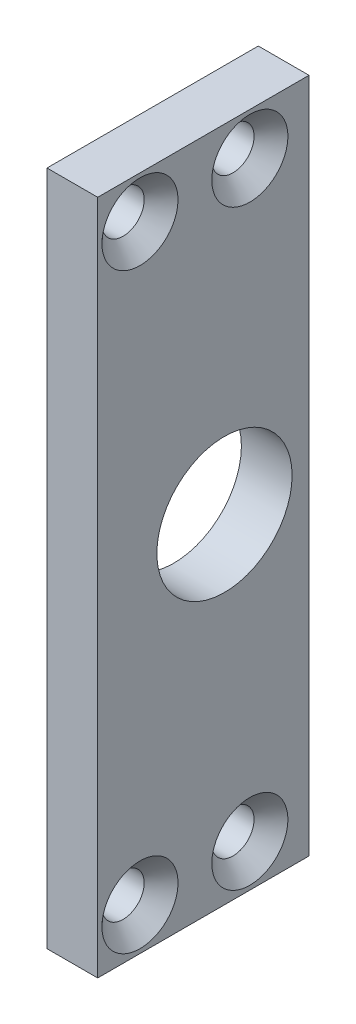
ISO-10303-21;
HEADER;
FILE_DESCRIPTION(('STEP AP214'),'2;1');
FILE_NAME('part.step','',(''),(''),'','','');
FILE_SCHEMA(('AUTOMOTIVE_DESIGN { 1 0 10303 214 1 1 1 1 }'));
ENDSEC;
DATA;
#1=APPLICATION_CONTEXT('core data for automotive mechanical design processes');
#2=APPLICATION_PROTOCOL_DEFINITION('international standard','automotive_design',2000,#1);
#3=PRODUCT_CONTEXT('',#1,'mechanical');
#4=PRODUCT('Part','Part','',(#3));
#5=PRODUCT_RELATED_PRODUCT_CATEGORY('part','',(#4));
#6=PRODUCT_DEFINITION_FORMATION('','',#4);
#7=PRODUCT_DEFINITION_CONTEXT('part definition',#1,'design');
#8=PRODUCT_DEFINITION('design','',#6,#7);
#9=PRODUCT_DEFINITION_SHAPE('','',#8);
#10=(LENGTH_UNIT() NAMED_UNIT(*) SI_UNIT(.MILLI.,.METRE.));
#11=(NAMED_UNIT(*) PLANE_ANGLE_UNIT() SI_UNIT($,.RADIAN.));
#12=(NAMED_UNIT(*) SI_UNIT($,.STERADIAN.) SOLID_ANGLE_UNIT());
#13=UNCERTAINTY_MEASURE_WITH_UNIT(LENGTH_MEASURE(1.E-05),#10,'distance_accuracy_value','');
#14=(GEOMETRIC_REPRESENTATION_CONTEXT(3) GLOBAL_UNCERTAINTY_ASSIGNED_CONTEXT((#13)) GLOBAL_UNIT_ASSIGNED_CONTEXT((#10,
#11,#12)) REPRESENTATION_CONTEXT('',''));
#15=CARTESIAN_POINT('',(0.,0.,0.));
#16=DIRECTION('',(0.,0.,1.));
#17=DIRECTION('',(1.,0.,0.));
#18=AXIS2_PLACEMENT_3D('',#15,#16,#17);
#19=CARTESIAN_POINT('',(6.,0.,0.));
#20=DIRECTION('',(0.,0.,-1.));
#21=DIRECTION('',(-1.,0.,0.));
#22=AXIS2_PLACEMENT_3D('',#19,#20,#21);
#23=PLANE('',#22);
#24=DIRECTION('',(0.,-1.,0.));
#25=VECTOR('',#24,1.);
#26=CARTESIAN_POINT('',(0.,0.,0.));
#27=LINE('',#26,#25);
#28=CARTESIAN_POINT('',(0.,80.,0.));
#29=VERTEX_POINT('',#28);
#30=CARTESIAN_POINT('',(0.,0.,0.));
#31=VERTEX_POINT('',#30);
#32=EDGE_CURVE('E100',#29,#31,#27,.T.);
#33=ORIENTED_EDGE('',*,*,#32,.T.);
#34=DIRECTION('',(-1.,0.,0.));
#35=VECTOR('',#34,1.);
#36=CARTESIAN_POINT('',(6.,0.,0.));
#37=LINE('',#36,#35);
#38=CARTESIAN_POINT('',(6.,0.,0.));
#39=VERTEX_POINT('',#38);
#40=EDGE_CURVE('E91',#39,#31,#37,.T.);
#41=ORIENTED_EDGE('',*,*,#40,.F.);
#42=DIRECTION('',(0.,-1.,0.));
#43=VECTOR('',#42,1.);
#44=CARTESIAN_POINT('',(6.,0.,0.));
#45=LINE('',#44,#43);
#46=CARTESIAN_POINT('',(6.,80.,0.));
#47=VERTEX_POINT('',#46);
#48=EDGE_CURVE('E85',#47,#39,#45,.T.);
#49=ORIENTED_EDGE('',*,*,#48,.F.);
#50=DIRECTION('',(-1.,0.,0.));
#51=VECTOR('',#50,1.);
#52=CARTESIAN_POINT('',(6.,80.,0.));
#53=LINE('',#52,#51);
#54=EDGE_CURVE('E96',#47,#29,#53,.T.);
#55=ORIENTED_EDGE('',*,*,#54,.T.);
#56=EDGE_LOOP('',(#33,#41,#49,#55));
#57=FACE_BOUND('',#56,.T.);
#58=ADVANCED_FACE('F32',(#57),#23,.F.);
#59=CARTESIAN_POINT('',(6.,0.,0.));
#60=DIRECTION('',(0.,1.,0.));
#61=DIRECTION('',(0.,0.,1.));
#62=AXIS2_PLACEMENT_3D('',#59,#60,#61);
#63=PLANE('',#62);
#64=DIRECTION('',(0.,0.,-1.));
#65=VECTOR('',#64,1.);
#66=CARTESIAN_POINT('',(0.,0.,0.));
#67=LINE('',#66,#65);
#68=CARTESIAN_POINT('',(0.,0.,-25.));
#69=VERTEX_POINT('',#68);
#70=EDGE_CURVE('E90',#31,#69,#67,.T.);
#71=ORIENTED_EDGE('',*,*,#70,.T.);
#72=DIRECTION('',(-1.,0.,0.));
#73=VECTOR('',#72,1.);
#74=CARTESIAN_POINT('',(6.,0.,-25.));
#75=LINE('',#74,#73);
#76=CARTESIAN_POINT('',(6.,0.,-25.));
#77=VERTEX_POINT('',#76);
#78=EDGE_CURVE('E88',#77,#69,#75,.T.);
#79=ORIENTED_EDGE('',*,*,#78,.F.);
#80=DIRECTION('',(0.,0.,-1.));
#81=VECTOR('',#80,1.);
#82=CARTESIAN_POINT('',(6.,0.,0.));
#83=LINE('',#82,#81);
#84=EDGE_CURVE('E80',#39,#77,#83,.T.);
#85=ORIENTED_EDGE('',*,*,#84,.F.);
#86=ORIENTED_EDGE('',*,*,#40,.T.);
#87=EDGE_LOOP('',(#71,#79,#85,#86));
#88=FACE_BOUND('',#87,.T.);
#89=ADVANCED_FACE('F89',(#88),#63,.F.);
#90=CARTESIAN_POINT('',(6.,0.,-25.));
#91=DIRECTION('',(0.,0.,1.));
#92=DIRECTION('',(1.,0.,0.));
#93=AXIS2_PLACEMENT_3D('',#90,#91,#92);
#94=PLANE('',#93);
#95=DIRECTION('',(0.,1.,0.));
#96=VECTOR('',#95,1.);
#97=CARTESIAN_POINT('',(0.,0.,-25.));
#98=LINE('',#97,#96);
#99=CARTESIAN_POINT('',(0.,80.,-25.));
#100=VERTEX_POINT('',#99);
#101=EDGE_CURVE('E66',#69,#100,#98,.T.);
#102=ORIENTED_EDGE('',*,*,#101,.T.);
#103=DIRECTION('',(-1.,0.,0.));
#104=VECTOR('',#103,1.);
#105=CARTESIAN_POINT('',(6.,80.,-25.));
#106=LINE('',#105,#104);
#107=CARTESIAN_POINT('',(6.,80.,-25.));
#108=VERTEX_POINT('',#107);
#109=EDGE_CURVE('E92',#108,#100,#106,.T.);
#110=ORIENTED_EDGE('',*,*,#109,.F.);
#111=DIRECTION('',(0.,1.,0.));
#112=VECTOR('',#111,1.);
#113=CARTESIAN_POINT('',(6.,0.,-25.));
#114=LINE('',#113,#112);
#115=EDGE_CURVE('E83',#77,#108,#114,.T.);
#116=ORIENTED_EDGE('',*,*,#115,.F.);
#117=ORIENTED_EDGE('',*,*,#78,.T.);
#118=EDGE_LOOP('',(#102,#110,#116,#117));
#119=FACE_BOUND('',#118,.T.);
#120=ADVANCED_FACE('F94',(#119),#94,.F.);
#121=CARTESIAN_POINT('',(6.,80.,0.));
#122=DIRECTION('',(0.,-1.,0.));
#123=DIRECTION('',(0.,0.,-1.));
#124=AXIS2_PLACEMENT_3D('',#121,#122,#123);
#125=PLANE('',#124);
#126=DIRECTION('',(0.,0.,1.));
#127=VECTOR('',#126,1.);
#128=CARTESIAN_POINT('',(0.,80.,0.));
#129=LINE('',#128,#127);
#130=EDGE_CURVE('E72',#100,#29,#129,.T.);
#131=ORIENTED_EDGE('',*,*,#130,.T.);
#132=ORIENTED_EDGE('',*,*,#54,.F.);
#133=DIRECTION('',(0.,0.,1.));
#134=VECTOR('',#133,1.);
#135=CARTESIAN_POINT('',(6.,80.,0.));
#136=LINE('',#135,#134);
#137=EDGE_CURVE('E49',#108,#47,#136,.T.);
#138=ORIENTED_EDGE('',*,*,#137,.F.);
#139=ORIENTED_EDGE('',*,*,#109,.T.);
#140=EDGE_LOOP('',(#131,#132,#138,#139));
#141=FACE_BOUND('',#140,.T.);
#142=ADVANCED_FACE('F198',(#141),#125,.F.);
#143=CARTESIAN_POINT('',(6.,80.,0.));
#144=DIRECTION('',(-1.,0.,0.));
#145=DIRECTION('',(0.,0.,1.));
#146=AXIS2_PLACEMENT_3D('',#143,#144,#145);
#147=PLANE('',#146);
#148=CARTESIAN_POINT('',(6.,5.,-5.));
#149=DIRECTION('',(-1.,0.,0.));
#150=DIRECTION('',(0.,0.,1.));
#151=AXIS2_PLACEMENT_3D('',#148,#149,#150);
#152=CIRCLE('',#151,4.50000000000001);
#153=CARTESIAN_POINT('',(6.,5.,-0.499999999999988));
#154=VERTEX_POINT('',#153);
#155=EDGE_CURVE('E122',#154,#154,#152,.T.);
#156=ORIENTED_EDGE('',*,*,#155,.T.);
#157=EDGE_LOOP('',(#156));
#158=FACE_BOUND('',#157,.T.);
#159=CARTESIAN_POINT('',(6.,5.,-18.));
#160=DIRECTION('',(-1.,0.,0.));
#161=DIRECTION('',(0.,0.,1.));
#162=AXIS2_PLACEMENT_3D('',#159,#160,#161);
#163=CIRCLE('',#162,4.50000000000001);
#164=CARTESIAN_POINT('',(6.,5.,-13.5));
#165=VERTEX_POINT('',#164);
#166=EDGE_CURVE('E119',#165,#165,#163,.T.);
#167=ORIENTED_EDGE('',*,*,#166,.T.);
#168=EDGE_LOOP('',(#167));
#169=FACE_BOUND('',#168,.T.);
#170=CARTESIAN_POINT('',(6.,75.,-17.9999999999998));
#171=DIRECTION('',(-1.,0.,0.));
#172=DIRECTION('',(0.,0.,1.));
#173=AXIS2_PLACEMENT_3D('',#170,#171,#172);
#174=CIRCLE('',#173,4.50000000000001);
#175=CARTESIAN_POINT('',(6.,75.,-13.4999999999997));
#176=VERTEX_POINT('',#175);
#177=EDGE_CURVE('E116',#176,#176,#174,.T.);
#178=ORIENTED_EDGE('',*,*,#177,.T.);
#179=EDGE_LOOP('',(#178));
#180=FACE_BOUND('',#179,.T.);
#181=CARTESIAN_POINT('',(6.,75.,-4.99999999999976));
#182=DIRECTION('',(-1.,0.,0.));
#183=DIRECTION('',(0.,0.,1.));
#184=AXIS2_PLACEMENT_3D('',#181,#182,#183);
#185=CIRCLE('',#184,4.50000000000001);
#186=CARTESIAN_POINT('',(6.,75.,-0.499999999999744));
#187=VERTEX_POINT('',#186);
#188=EDGE_CURVE('E113',#187,#187,#185,.T.);
#189=ORIENTED_EDGE('',*,*,#188,.T.);
#190=EDGE_LOOP('',(#189));
#191=FACE_BOUND('',#190,.T.);
#192=CARTESIAN_POINT('',(6.,40.,-15.));
#193=DIRECTION('',(1.,0.,0.));
#194=DIRECTION('',(0.,0.,-1.));
#195=AXIS2_PLACEMENT_3D('',#192,#193,#194);
#196=CIRCLE('',#195,8.);
#197=CARTESIAN_POINT('',(6.,40.,-23.));
#198=VERTEX_POINT('',#197);
#199=EDGE_CURVE('E176',#198,#198,#196,.T.);
#200=ORIENTED_EDGE('',*,*,#199,.F.);
#201=EDGE_LOOP('',(#200));
#202=FACE_BOUND('',#201,.T.);
#203=ORIENTED_EDGE('',*,*,#48,.T.);
#204=ORIENTED_EDGE('',*,*,#84,.T.);
#205=ORIENTED_EDGE('',*,*,#115,.T.);
#206=ORIENTED_EDGE('',*,*,#137,.T.);
#207=EDGE_LOOP('',(#203,#204,#205,#206));
#208=FACE_BOUND('',#207,.T.);
#209=ADVANCED_FACE('F81',(#158,#169,#180,#191,#202,#208),#147,.F.);
#210=CARTESIAN_POINT('',(0.,80.,0.));
#211=DIRECTION('',(-1.,0.,0.));
#212=DIRECTION('',(0.,0.,1.));
#213=AXIS2_PLACEMENT_3D('',#210,#211,#212);
#214=PLANE('',#213);
#215=CARTESIAN_POINT('',(0.,75.,-17.9999999999998));
#216=DIRECTION('',(1.,0.,0.));
#217=DIRECTION('',(0.,0.,-1.));
#218=AXIS2_PLACEMENT_3D('',#215,#216,#217);
#219=CIRCLE('',#218,2.5);
#220=CARTESIAN_POINT('',(0.,75.,-20.4999999999998));
#221=VERTEX_POINT('',#220);
#222=EDGE_CURVE('E293',#221,#221,#219,.T.);
#223=ORIENTED_EDGE('',*,*,#222,.T.);
#224=EDGE_LOOP('',(#223));
#225=FACE_BOUND('',#224,.T.);
#226=CARTESIAN_POINT('',(0.,75.,-4.99999999999976));
#227=DIRECTION('',(1.,0.,0.));
#228=DIRECTION('',(0.,0.,-1.));
#229=AXIS2_PLACEMENT_3D('',#226,#227,#228);
#230=CIRCLE('',#229,2.5);
#231=CARTESIAN_POINT('',(0.,75.,-7.49999999999976));
#232=VERTEX_POINT('',#231);
#233=EDGE_CURVE('E182',#232,#232,#230,.T.);
#234=ORIENTED_EDGE('',*,*,#233,.T.);
#235=EDGE_LOOP('',(#234));
#236=FACE_BOUND('',#235,.T.);
#237=CARTESIAN_POINT('',(0.,5.,-18.));
#238=DIRECTION('',(1.,0.,0.));
#239=DIRECTION('',(0.,0.,-1.));
#240=AXIS2_PLACEMENT_3D('',#237,#238,#239);
#241=CIRCLE('',#240,2.5);
#242=CARTESIAN_POINT('',(0.,5.,-20.5));
#243=VERTEX_POINT('',#242);
#244=EDGE_CURVE('E177',#243,#243,#241,.T.);
#245=ORIENTED_EDGE('',*,*,#244,.T.);
#246=EDGE_LOOP('',(#245));
#247=FACE_BOUND('',#246,.T.);
#248=CARTESIAN_POINT('',(0.,5.,-5.));
#249=DIRECTION('',(1.,0.,0.));
#250=DIRECTION('',(0.,0.,-1.));
#251=AXIS2_PLACEMENT_3D('',#248,#249,#250);
#252=CIRCLE('',#251,2.5);
#253=CARTESIAN_POINT('',(0.,5.,-7.5));
#254=VERTEX_POINT('',#253);
#255=EDGE_CURVE('E174',#254,#254,#252,.T.);
#256=ORIENTED_EDGE('',*,*,#255,.T.);
#257=EDGE_LOOP('',(#256));
#258=FACE_BOUND('',#257,.T.);
#259=CARTESIAN_POINT('',(0.,40.,-15.));
#260=DIRECTION('',(1.,0.,0.));
#261=DIRECTION('',(0.,0.,-1.));
#262=AXIS2_PLACEMENT_3D('',#259,#260,#261);
#263=CIRCLE('',#262,8.);
#264=CARTESIAN_POINT('',(0.,40.,-23.));
#265=VERTEX_POINT('',#264);
#266=EDGE_CURVE('E103',#265,#265,#263,.T.);
#267=ORIENTED_EDGE('',*,*,#266,.T.);
#268=EDGE_LOOP('',(#267));
#269=FACE_BOUND('',#268,.T.);
#270=ORIENTED_EDGE('',*,*,#32,.F.);
#271=ORIENTED_EDGE('',*,*,#130,.F.);
#272=ORIENTED_EDGE('',*,*,#101,.F.);
#273=ORIENTED_EDGE('',*,*,#70,.F.);
#274=EDGE_LOOP('',(#270,#271,#272,#273));
#275=FACE_BOUND('',#274,.T.);
#276=ADVANCED_FACE('F189',(#225,#236,#247,#258,#269,#275),#214,.T.);
#277=CARTESIAN_POINT('',(0.,40.,-15.));
#278=DIRECTION('',(1.,0.,0.));
#279=DIRECTION('',(0.,0.,-1.));
#280=AXIS2_PLACEMENT_3D('',#277,#278,#279);
#281=CYLINDRICAL_SURFACE('',#280,8.);
#282=ORIENTED_EDGE('',*,*,#266,.F.);
#283=EDGE_LOOP('',(#282));
#284=FACE_BOUND('',#283,.T.);
#285=ORIENTED_EDGE('',*,*,#199,.T.);
#286=EDGE_LOOP('',(#285));
#287=FACE_BOUND('',#286,.T.);
#288=ADVANCED_FACE('F170',(#284,#287),#281,.F.);
#289=CARTESIAN_POINT('',(0.,5.,-5.));
#290=DIRECTION('',(1.,0.,0.));
#291=DIRECTION('',(0.,0.,-1.));
#292=AXIS2_PLACEMENT_3D('',#289,#290,#291);
#293=CYLINDRICAL_SURFACE('',#292,2.5);
#294=CARTESIAN_POINT('',(4.,5.,-5.));
#295=DIRECTION('',(-1.,0.,0.));
#296=DIRECTION('',(0.,0.,1.));
#297=AXIS2_PLACEMENT_3D('',#294,#295,#296);
#298=CIRCLE('',#297,2.5);
#299=CARTESIAN_POINT('',(4.,5.,-2.5));
#300=VERTEX_POINT('',#299);
#301=EDGE_CURVE('E110',#300,#300,#298,.F.);
#302=ORIENTED_EDGE('',*,*,#301,.T.);
#303=EDGE_LOOP('',(#302));
#304=FACE_BOUND('',#303,.T.);
#305=ORIENTED_EDGE('',*,*,#255,.F.);
#306=EDGE_LOOP('',(#305));
#307=FACE_BOUND('',#306,.T.);
#308=ADVANCED_FACE('F166',(#304,#307),#293,.F.);
#309=CARTESIAN_POINT('',(0.,5.,-18.));
#310=DIRECTION('',(1.,0.,0.));
#311=DIRECTION('',(0.,0.,-1.));
#312=AXIS2_PLACEMENT_3D('',#309,#310,#311);
#313=CYLINDRICAL_SURFACE('',#312,2.5);
#314=CARTESIAN_POINT('',(4.,5.,-18.));
#315=DIRECTION('',(-1.,0.,0.));
#316=DIRECTION('',(0.,0.,1.));
#317=AXIS2_PLACEMENT_3D('',#314,#315,#316);
#318=CIRCLE('',#317,2.5);
#319=CARTESIAN_POINT('',(4.,5.,-15.5));
#320=VERTEX_POINT('',#319);
#321=EDGE_CURVE('E125',#320,#320,#318,.F.);
#322=ORIENTED_EDGE('',*,*,#321,.T.);
#323=EDGE_LOOP('',(#322));
#324=FACE_BOUND('',#323,.T.);
#325=ORIENTED_EDGE('',*,*,#244,.F.);
#326=EDGE_LOOP('',(#325));
#327=FACE_BOUND('',#326,.T.);
#328=ADVANCED_FACE('F169',(#324,#327),#313,.F.);
#329=CARTESIAN_POINT('',(0.,75.,-4.99999999999976));
#330=DIRECTION('',(1.,0.,0.));
#331=DIRECTION('',(0.,0.,-1.));
#332=AXIS2_PLACEMENT_3D('',#329,#330,#331);
#333=CYLINDRICAL_SURFACE('',#332,2.5);
#334=CARTESIAN_POINT('',(4.,75.,-4.99999999999976));
#335=DIRECTION('',(-1.,0.,0.));
#336=DIRECTION('',(0.,0.,1.));
#337=AXIS2_PLACEMENT_3D('',#334,#335,#336);
#338=CIRCLE('',#337,2.5);
#339=CARTESIAN_POINT('',(4.,75.,-2.49999999999975));
#340=VERTEX_POINT('',#339);
#341=EDGE_CURVE('E11',#340,#340,#338,.F.);
#342=ORIENTED_EDGE('',*,*,#341,.T.);
#343=EDGE_LOOP('',(#342));
#344=FACE_BOUND('',#343,.T.);
#345=ORIENTED_EDGE('',*,*,#233,.F.);
#346=EDGE_LOOP('',(#345));
#347=FACE_BOUND('',#346,.T.);
#348=ADVANCED_FACE('F160',(#344,#347),#333,.F.);
#349=CARTESIAN_POINT('',(0.,75.,-17.9999999999998));
#350=DIRECTION('',(1.,0.,0.));
#351=DIRECTION('',(0.,0.,-1.));
#352=AXIS2_PLACEMENT_3D('',#349,#350,#351);
#353=CYLINDRICAL_SURFACE('',#352,2.5);
#354=CARTESIAN_POINT('',(3.99999999999999,75.,-17.9999999999998));
#355=DIRECTION('',(-1.,0.,0.));
#356=DIRECTION('',(0.,0.,1.));
#357=AXIS2_PLACEMENT_3D('',#354,#355,#356);
#358=CIRCLE('',#357,2.5);
#359=CARTESIAN_POINT('',(3.99999999999999,75.,-15.4999999999998));
#360=VERTEX_POINT('',#359);
#361=EDGE_CURVE('E41',#360,#360,#358,.F.);
#362=ORIENTED_EDGE('',*,*,#361,.T.);
#363=EDGE_LOOP('',(#362));
#364=FACE_BOUND('',#363,.T.);
#365=ORIENTED_EDGE('',*,*,#222,.F.);
#366=EDGE_LOOP('',(#365));
#367=FACE_BOUND('',#366,.T.);
#368=ADVANCED_FACE('F130',(#364,#367),#353,.F.);
#369=CARTESIAN_POINT('',(4.,5.,-5.));
#370=DIRECTION('',(1.,0.,0.));
#371=DIRECTION('',(0.,0.,-1.));
#372=AXIS2_PLACEMENT_3D('',#369,#370,#371);
#373=CONICAL_SURFACE('',#372,2.5,0.78539816339745);
#374=ORIENTED_EDGE('',*,*,#155,.F.);
#375=EDGE_LOOP('',(#374));
#376=FACE_BOUND('',#375,.T.);
#377=ORIENTED_EDGE('',*,*,#301,.F.);
#378=EDGE_LOOP('',(#377));
#379=FACE_BOUND('',#378,.T.);
#380=ADVANCED_FACE('F142',(#376,#379),#373,.F.);
#381=CARTESIAN_POINT('',(4.,5.,-18.));
#382=DIRECTION('',(1.,0.,0.));
#383=DIRECTION('',(0.,0.,-1.));
#384=AXIS2_PLACEMENT_3D('',#381,#382,#383);
#385=CONICAL_SURFACE('',#384,2.5,0.78539816339745);
#386=ORIENTED_EDGE('',*,*,#166,.F.);
#387=EDGE_LOOP('',(#386));
#388=FACE_BOUND('',#387,.T.);
#389=ORIENTED_EDGE('',*,*,#321,.F.);
#390=EDGE_LOOP('',(#389));
#391=FACE_BOUND('',#390,.T.);
#392=ADVANCED_FACE('F135',(#388,#391),#385,.F.);
#393=CARTESIAN_POINT('',(3.99999999999999,75.,-17.9999999999998));
#394=DIRECTION('',(1.,0.,0.));
#395=DIRECTION('',(0.,0.,-1.));
#396=AXIS2_PLACEMENT_3D('',#393,#394,#395);
#397=CONICAL_SURFACE('',#396,2.5,0.78539816339745);
#398=ORIENTED_EDGE('',*,*,#177,.F.);
#399=EDGE_LOOP('',(#398));
#400=FACE_BOUND('',#399,.T.);
#401=ORIENTED_EDGE('',*,*,#361,.F.);
#402=EDGE_LOOP('',(#401));
#403=FACE_BOUND('',#402,.T.);
#404=ADVANCED_FACE('F133',(#400,#403),#397,.F.);
#405=CARTESIAN_POINT('',(4.,75.,-4.99999999999976));
#406=DIRECTION('',(1.,0.,0.));
#407=DIRECTION('',(0.,0.,-1.));
#408=AXIS2_PLACEMENT_3D('',#405,#406,#407);
#409=CONICAL_SURFACE('',#408,2.5,0.78539816339745);
#410=ORIENTED_EDGE('',*,*,#188,.F.);
#411=EDGE_LOOP('',(#410));
#412=FACE_BOUND('',#411,.T.);
#413=ORIENTED_EDGE('',*,*,#341,.F.);
#414=EDGE_LOOP('',(#413));
#415=FACE_BOUND('',#414,.T.);
#416=ADVANCED_FACE('F34',(#412,#415),#409,.F.);
#417=CLOSED_SHELL('',(#58,#89,#120,#142,#209,#276,#288,#308,#328,#348,#368,#380,#392,#404,#416));
#418=MANIFOLD_SOLID_BREP('B2',#417);
#419=ADVANCED_BREP_SHAPE_REPRESENTATION('',(#18,#418),#14);
#420=SHAPE_DEFINITION_REPRESENTATION(#9,#419);
ENDSEC;
END-ISO-10303-21;
